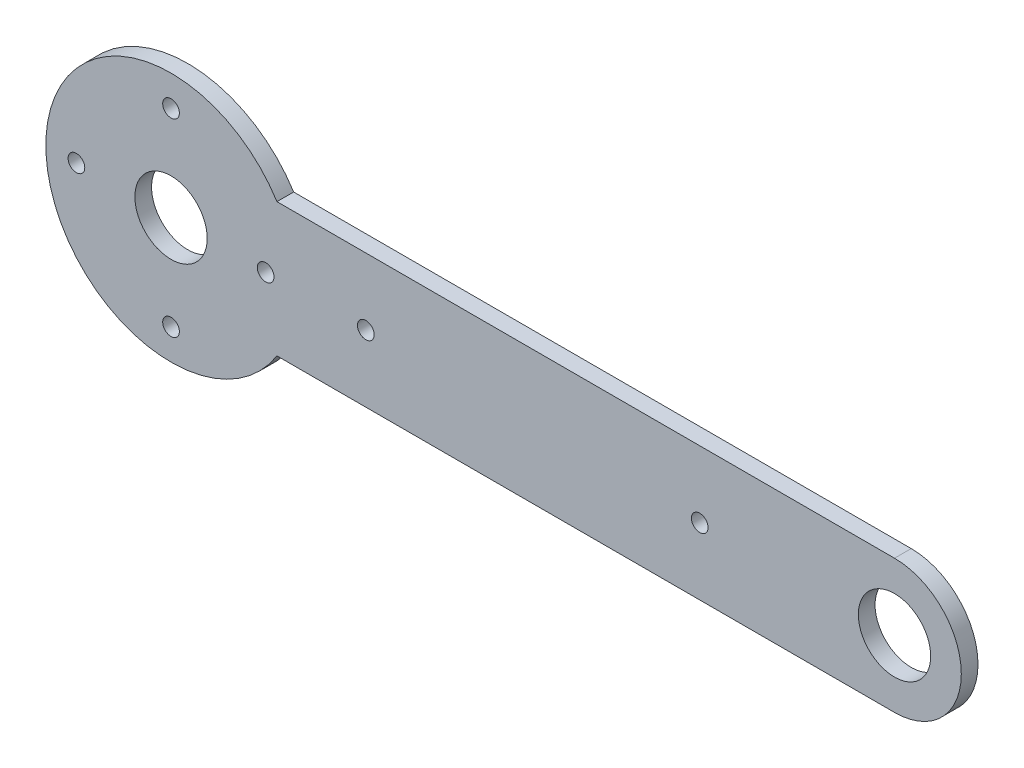
ISO-10303-21;
HEADER;
FILE_DESCRIPTION(('STEP AP214'),'2;1');
FILE_NAME('part.step','',(''),(''),'','','');
FILE_SCHEMA(('AUTOMOTIVE_DESIGN { 1 0 10303 214 1 1 1 1 }'));
ENDSEC;
DATA;
#1=APPLICATION_CONTEXT('core data for automotive mechanical design processes');
#2=APPLICATION_PROTOCOL_DEFINITION('international standard','automotive_design',2000,#1);
#3=PRODUCT_CONTEXT('',#1,'mechanical');
#4=PRODUCT('Part','Part','',(#3));
#5=PRODUCT_RELATED_PRODUCT_CATEGORY('part','',(#4));
#6=PRODUCT_DEFINITION_FORMATION('','',#4);
#7=PRODUCT_DEFINITION_CONTEXT('part definition',#1,'design');
#8=PRODUCT_DEFINITION('design','',#6,#7);
#9=PRODUCT_DEFINITION_SHAPE('','',#8);
#10=(LENGTH_UNIT() NAMED_UNIT(*) SI_UNIT(.MILLI.,.METRE.));
#11=(NAMED_UNIT(*) PLANE_ANGLE_UNIT() SI_UNIT($,.RADIAN.));
#12=(NAMED_UNIT(*) SI_UNIT($,.STERADIAN.) SOLID_ANGLE_UNIT());
#13=UNCERTAINTY_MEASURE_WITH_UNIT(LENGTH_MEASURE(1.E-05),#10,'distance_accuracy_value','');
#14=(GEOMETRIC_REPRESENTATION_CONTEXT(3) GLOBAL_UNCERTAINTY_ASSIGNED_CONTEXT((#13)) GLOBAL_UNIT_ASSIGNED_CONTEXT((#10,
#11,#12)) REPRESENTATION_CONTEXT('',''));
#15=CARTESIAN_POINT('',(0.,0.,0.));
#16=DIRECTION('',(0.,0.,1.));
#17=DIRECTION('',(1.,0.,0.));
#18=AXIS2_PLACEMENT_3D('',#15,#16,#17);
#19=CARTESIAN_POINT('',(-65.,0.,3.));
#20=DIRECTION('',(0.,0.,1.));
#21=DIRECTION('',(1.,0.,0.));
#22=AXIS2_PLACEMENT_3D('',#19,#20,#21);
#23=PLANE('',#22);
#24=CARTESIAN_POINT('',(-65.,17.,3.));
#25=DIRECTION('',(0.,0.,1.));
#26=DIRECTION('',(1.,0.,0.));
#27=AXIS2_PLACEMENT_3D('',#24,#25,#26);
#28=CIRCLE('',#27,1.5);
#29=CARTESIAN_POINT('',(-63.5,17.,3.));
#30=VERTEX_POINT('',#29);
#31=EDGE_CURVE('E240',#30,#30,#28,.T.);
#32=ORIENTED_EDGE('',*,*,#31,.F.);
#33=EDGE_LOOP('',(#32));
#34=FACE_BOUND('',#33,.T.);
#35=CARTESIAN_POINT('',(-47.9999999999998,1.80411241501588E-13,3.));
#36=DIRECTION('',(0.,0.,1.));
#37=DIRECTION('',(1.,0.,0.));
#38=AXIS2_PLACEMENT_3D('',#35,#36,#37);
#39=CIRCLE('',#38,1.5);
#40=CARTESIAN_POINT('',(-46.4999999999998,1.80411241501588E-13,3.));
#41=VERTEX_POINT('',#40);
#42=EDGE_CURVE('E248',#41,#41,#39,.T.);
#43=ORIENTED_EDGE('',*,*,#42,.F.);
#44=EDGE_LOOP('',(#43));
#45=FACE_BOUND('',#44,.T.);
#46=CARTESIAN_POINT('',(-64.9999999999996,-17.,3.));
#47=DIRECTION('',(0.,0.,1.));
#48=DIRECTION('',(1.,0.,0.));
#49=AXIS2_PLACEMENT_3D('',#46,#47,#48);
#50=CIRCLE('',#49,1.49999999999999);
#51=CARTESIAN_POINT('',(-63.4999999999996,-17.,3.));
#52=VERTEX_POINT('',#51);
#53=EDGE_CURVE('E258',#52,#52,#50,.T.);
#54=ORIENTED_EDGE('',*,*,#53,.F.);
#55=EDGE_LOOP('',(#54));
#56=FACE_BOUND('',#55,.T.);
#57=CARTESIAN_POINT('',(-81.9999999999997,0.,3.));
#58=DIRECTION('',(0.,0.,1.));
#59=DIRECTION('',(1.,0.,0.));
#60=AXIS2_PLACEMENT_3D('',#57,#58,#59);
#61=CIRCLE('',#60,1.49999999999999);
#62=CARTESIAN_POINT('',(-80.4999999999998,0.,3.));
#63=VERTEX_POINT('',#62);
#64=EDGE_CURVE('E132',#63,#63,#61,.T.);
#65=ORIENTED_EDGE('',*,*,#64,.F.);
#66=EDGE_LOOP('',(#65));
#67=FACE_BOUND('',#66,.T.);
#68=DIRECTION('',(-1.,0.,0.));
#69=VECTOR('',#68,1.);
#70=CARTESIAN_POINT('',(-65.,12.,3.));
#71=LINE('',#70,#69);
#72=CARTESIAN_POINT('',(65.,12.,3.));
#73=VERTEX_POINT('',#72);
#74=CARTESIAN_POINT('',(-45.9671336893257,12.,3.));
#75=VERTEX_POINT('',#74);
#76=EDGE_CURVE('E98',#73,#75,#71,.T.);
#77=ORIENTED_EDGE('',*,*,#76,.T.);
#78=CARTESIAN_POINT('',(-65.,0.,3.));
#79=DIRECTION('',(0.,0.,1.));
#80=DIRECTION('',(1.,0.,0.));
#81=AXIS2_PLACEMENT_3D('',#78,#79,#80);
#82=CIRCLE('',#81,22.5);
#83=CARTESIAN_POINT('',(-45.9671336893257,-12.,3.));
#84=VERTEX_POINT('',#83);
#85=EDGE_CURVE('E86',#75,#84,#82,.T.);
#86=ORIENTED_EDGE('',*,*,#85,.T.);
#87=DIRECTION('',(1.,0.,0.));
#88=VECTOR('',#87,1.);
#89=CARTESIAN_POINT('',(-65.,-12.,3.));
#90=LINE('',#89,#88);
#91=CARTESIAN_POINT('',(65.,-12.,3.));
#92=VERTEX_POINT('',#91);
#93=EDGE_CURVE('E108',#84,#92,#90,.T.);
#94=ORIENTED_EDGE('',*,*,#93,.T.);
#95=CARTESIAN_POINT('',(65.,0.,3.));
#96=DIRECTION('',(0.,0.,1.));
#97=DIRECTION('',(-1.,0.,0.));
#98=AXIS2_PLACEMENT_3D('',#95,#96,#97);
#99=CIRCLE('',#98,12.);
#100=EDGE_CURVE('E58',#92,#73,#99,.T.);
#101=ORIENTED_EDGE('',*,*,#100,.T.);
#102=EDGE_LOOP('',(#77,#86,#94,#101));
#103=FACE_BOUND('',#102,.T.);
#104=CARTESIAN_POINT('',(30.,0.,3.));
#105=DIRECTION('',(0.,0.,-1.));
#106=DIRECTION('',(-1.,0.,0.));
#107=AXIS2_PLACEMENT_3D('',#104,#105,#106);
#108=CIRCLE('',#107,1.5);
#109=CARTESIAN_POINT('',(28.5,0.,3.));
#110=VERTEX_POINT('',#109);
#111=EDGE_CURVE('E144',#110,#110,#108,.T.);
#112=ORIENTED_EDGE('',*,*,#111,.T.);
#113=EDGE_LOOP('',(#112));
#114=FACE_BOUND('',#113,.T.);
#115=CARTESIAN_POINT('',(65.,0.,3.));
#116=DIRECTION('',(0.,0.,1.));
#117=DIRECTION('',(-1.,0.,0.));
#118=AXIS2_PLACEMENT_3D('',#115,#116,#117);
#119=CIRCLE('',#118,6.49999999999999);
#120=CARTESIAN_POINT('',(58.5,0.,3.));
#121=VERTEX_POINT('',#120);
#122=EDGE_CURVE('E139',#121,#121,#119,.T.);
#123=ORIENTED_EDGE('',*,*,#122,.F.);
#124=EDGE_LOOP('',(#123));
#125=FACE_BOUND('',#124,.T.);
#126=CARTESIAN_POINT('',(-30.,0.,3.));
#127=DIRECTION('',(0.,0.,1.));
#128=DIRECTION('',(1.,0.,0.));
#129=AXIS2_PLACEMENT_3D('',#126,#127,#128);
#130=CIRCLE('',#129,1.5);
#131=CARTESIAN_POINT('',(-28.5,0.,3.));
#132=VERTEX_POINT('',#131);
#133=EDGE_CURVE('E140',#132,#132,#130,.T.);
#134=ORIENTED_EDGE('',*,*,#133,.F.);
#135=EDGE_LOOP('',(#134));
#136=FACE_BOUND('',#135,.T.);
#137=CARTESIAN_POINT('',(-65.,0.,3.));
#138=DIRECTION('',(0.,0.,1.));
#139=DIRECTION('',(1.,0.,0.));
#140=AXIS2_PLACEMENT_3D('',#137,#138,#139);
#141=CIRCLE('',#140,6.5);
#142=CARTESIAN_POINT('',(-58.5,0.,3.));
#143=VERTEX_POINT('',#142);
#144=EDGE_CURVE('E154',#143,#143,#141,.T.);
#145=ORIENTED_EDGE('',*,*,#144,.F.);
#146=EDGE_LOOP('',(#145));
#147=FACE_BOUND('',#146,.T.);
#148=ADVANCED_FACE('F40',(#34,#45,#56,#67,#103,#114,#125,#136,#147),#23,.T.);
#149=CARTESIAN_POINT('',(-65.,0.,0.));
#150=DIRECTION('',(0.,0.,1.));
#151=DIRECTION('',(1.,0.,0.));
#152=AXIS2_PLACEMENT_3D('',#149,#150,#151);
#153=PLANE('',#152);
#154=CARTESIAN_POINT('',(-65.,17.,0.));
#155=DIRECTION('',(0.,0.,1.));
#156=DIRECTION('',(1.,0.,0.));
#157=AXIS2_PLACEMENT_3D('',#154,#155,#156);
#158=CIRCLE('',#157,1.5);
#159=CARTESIAN_POINT('',(-63.5,17.,0.));
#160=VERTEX_POINT('',#159);
#161=EDGE_CURVE('E91',#160,#160,#158,.T.);
#162=ORIENTED_EDGE('',*,*,#161,.T.);
#163=EDGE_LOOP('',(#162));
#164=FACE_BOUND('',#163,.T.);
#165=CARTESIAN_POINT('',(-47.9999999999998,1.80411241501588E-13,0.));
#166=DIRECTION('',(0.,0.,1.));
#167=DIRECTION('',(1.,0.,0.));
#168=AXIS2_PLACEMENT_3D('',#165,#166,#167);
#169=CIRCLE('',#168,1.5);
#170=CARTESIAN_POINT('',(-46.4999999999998,1.80411241501588E-13,0.));
#171=VERTEX_POINT('',#170);
#172=EDGE_CURVE('E242',#171,#171,#169,.T.);
#173=ORIENTED_EDGE('',*,*,#172,.T.);
#174=EDGE_LOOP('',(#173));
#175=FACE_BOUND('',#174,.T.);
#176=CARTESIAN_POINT('',(-64.9999999999996,-17.,0.));
#177=DIRECTION('',(0.,0.,1.));
#178=DIRECTION('',(1.,0.,0.));
#179=AXIS2_PLACEMENT_3D('',#176,#177,#178);
#180=CIRCLE('',#179,1.49999999999999);
#181=CARTESIAN_POINT('',(-63.4999999999996,-17.,0.));
#182=VERTEX_POINT('',#181);
#183=EDGE_CURVE('E254',#182,#182,#180,.T.);
#184=ORIENTED_EDGE('',*,*,#183,.T.);
#185=EDGE_LOOP('',(#184));
#186=FACE_BOUND('',#185,.T.);
#187=CARTESIAN_POINT('',(-81.9999999999997,0.,0.));
#188=DIRECTION('',(0.,0.,1.));
#189=DIRECTION('',(1.,0.,0.));
#190=AXIS2_PLACEMENT_3D('',#187,#188,#189);
#191=CIRCLE('',#190,1.49999999999999);
#192=CARTESIAN_POINT('',(-80.4999999999998,0.,0.));
#193=VERTEX_POINT('',#192);
#194=EDGE_CURVE('E261',#193,#193,#191,.T.);
#195=ORIENTED_EDGE('',*,*,#194,.T.);
#196=EDGE_LOOP('',(#195));
#197=FACE_BOUND('',#196,.T.);
#198=DIRECTION('',(1.,0.,0.));
#199=VECTOR('',#198,1.);
#200=CARTESIAN_POINT('',(-65.,-12.,0.));
#201=LINE('',#200,#199);
#202=CARTESIAN_POINT('',(-45.9671336893257,-12.,0.));
#203=VERTEX_POINT('',#202);
#204=CARTESIAN_POINT('',(65.,-12.,0.));
#205=VERTEX_POINT('',#204);
#206=EDGE_CURVE('E69',#203,#205,#201,.T.);
#207=ORIENTED_EDGE('',*,*,#206,.F.);
#208=CARTESIAN_POINT('',(-65.,0.,0.));
#209=DIRECTION('',(0.,0.,1.));
#210=DIRECTION('',(1.,0.,0.));
#211=AXIS2_PLACEMENT_3D('',#208,#209,#210);
#212=CIRCLE('',#211,22.5);
#213=CARTESIAN_POINT('',(-45.9671336893257,12.,0.));
#214=VERTEX_POINT('',#213);
#215=EDGE_CURVE('E78',#214,#203,#212,.T.);
#216=ORIENTED_EDGE('',*,*,#215,.F.);
#217=DIRECTION('',(-1.,0.,0.));
#218=VECTOR('',#217,1.);
#219=CARTESIAN_POINT('',(-65.,12.,0.));
#220=LINE('',#219,#218);
#221=CARTESIAN_POINT('',(65.,12.,0.));
#222=VERTEX_POINT('',#221);
#223=EDGE_CURVE('E100',#222,#214,#220,.T.);
#224=ORIENTED_EDGE('',*,*,#223,.F.);
#225=CARTESIAN_POINT('',(65.,0.,0.));
#226=DIRECTION('',(0.,0.,1.));
#227=DIRECTION('',(-1.,0.,0.));
#228=AXIS2_PLACEMENT_3D('',#225,#226,#227);
#229=CIRCLE('',#228,12.);
#230=EDGE_CURVE('E114',#205,#222,#229,.T.);
#231=ORIENTED_EDGE('',*,*,#230,.F.);
#232=EDGE_LOOP('',(#207,#216,#224,#231));
#233=FACE_BOUND('',#232,.T.);
#234=CARTESIAN_POINT('',(65.,0.,0.));
#235=DIRECTION('',(0.,0.,1.));
#236=DIRECTION('',(-1.,0.,0.));
#237=AXIS2_PLACEMENT_3D('',#234,#235,#236);
#238=CIRCLE('',#237,6.49999999999999);
#239=CARTESIAN_POINT('',(58.5,0.,0.));
#240=VERTEX_POINT('',#239);
#241=EDGE_CURVE('E158',#240,#240,#238,.T.);
#242=ORIENTED_EDGE('',*,*,#241,.T.);
#243=EDGE_LOOP('',(#242));
#244=FACE_BOUND('',#243,.T.);
#245=CARTESIAN_POINT('',(30.,0.,0.));
#246=DIRECTION('',(0.,0.,-1.));
#247=DIRECTION('',(-1.,0.,0.));
#248=AXIS2_PLACEMENT_3D('',#245,#246,#247);
#249=CIRCLE('',#248,1.5);
#250=CARTESIAN_POINT('',(28.5,0.,0.));
#251=VERTEX_POINT('',#250);
#252=EDGE_CURVE('E129',#251,#251,#249,.T.);
#253=ORIENTED_EDGE('',*,*,#252,.F.);
#254=EDGE_LOOP('',(#253));
#255=FACE_BOUND('',#254,.T.);
#256=CARTESIAN_POINT('',(-30.,0.,0.));
#257=DIRECTION('',(0.,0.,1.));
#258=DIRECTION('',(1.,0.,0.));
#259=AXIS2_PLACEMENT_3D('',#256,#257,#258);
#260=CIRCLE('',#259,1.5);
#261=CARTESIAN_POINT('',(-28.5,0.,0.));
#262=VERTEX_POINT('',#261);
#263=EDGE_CURVE('E135',#262,#262,#260,.T.);
#264=ORIENTED_EDGE('',*,*,#263,.T.);
#265=EDGE_LOOP('',(#264));
#266=FACE_BOUND('',#265,.T.);
#267=CARTESIAN_POINT('',(-65.,0.,0.));
#268=DIRECTION('',(0.,0.,1.));
#269=DIRECTION('',(1.,0.,0.));
#270=AXIS2_PLACEMENT_3D('',#267,#268,#269);
#271=CIRCLE('',#270,6.5);
#272=CARTESIAN_POINT('',(-58.5,0.,0.));
#273=VERTEX_POINT('',#272);
#274=EDGE_CURVE('E115',#273,#273,#271,.T.);
#275=ORIENTED_EDGE('',*,*,#274,.T.);
#276=EDGE_LOOP('',(#275));
#277=FACE_BOUND('',#276,.T.);
#278=ADVANCED_FACE('F124',(#164,#175,#186,#197,#233,#244,#255,#266,#277),#153,.F.);
#279=CARTESIAN_POINT('',(-65.,-12.,3.));
#280=DIRECTION('',(0.,1.,0.));
#281=DIRECTION('',(-1.,0.,0.));
#282=AXIS2_PLACEMENT_3D('',#279,#280,#281);
#283=PLANE('',#282);
#284=ORIENTED_EDGE('',*,*,#93,.F.);
#285=DIRECTION('',(0.,0.,1.));
#286=VECTOR('',#285,1.);
#287=CARTESIAN_POINT('',(-45.9671336893257,-12.,0.));
#288=LINE('',#287,#286);
#289=EDGE_CURVE('E88',#84,#203,#288,.F.);
#290=ORIENTED_EDGE('',*,*,#289,.T.);
#291=ORIENTED_EDGE('',*,*,#206,.T.);
#292=DIRECTION('',(0.,0.,-1.));
#293=VECTOR('',#292,1.);
#294=CARTESIAN_POINT('',(65.,-12.,3.));
#295=LINE('',#294,#293);
#296=EDGE_CURVE('E50',#92,#205,#295,.T.);
#297=ORIENTED_EDGE('',*,*,#296,.F.);
#298=EDGE_LOOP('',(#284,#290,#291,#297));
#299=FACE_BOUND('',#298,.T.);
#300=ADVANCED_FACE('F42',(#299),#283,.F.);
#301=CARTESIAN_POINT('',(65.,0.,3.));
#302=DIRECTION('',(0.,0.,-1.));
#303=DIRECTION('',(-1.,0.,0.));
#304=AXIS2_PLACEMENT_3D('',#301,#302,#303);
#305=CYLINDRICAL_SURFACE('',#304,12.);
#306=ORIENTED_EDGE('',*,*,#230,.T.);
#307=DIRECTION('',(0.,0.,-1.));
#308=VECTOR('',#307,1.);
#309=CARTESIAN_POINT('',(65.,12.,3.));
#310=LINE('',#309,#308);
#311=EDGE_CURVE('E103',#73,#222,#310,.T.);
#312=ORIENTED_EDGE('',*,*,#311,.F.);
#313=ORIENTED_EDGE('',*,*,#100,.F.);
#314=ORIENTED_EDGE('',*,*,#296,.T.);
#315=EDGE_LOOP('',(#306,#312,#313,#314));
#316=FACE_BOUND('',#315,.T.);
#317=ADVANCED_FACE('F122',(#316),#305,.T.);
#318=CARTESIAN_POINT('',(-65.,12.,3.));
#319=DIRECTION('',(0.,-1.,0.));
#320=DIRECTION('',(1.,0.,0.));
#321=AXIS2_PLACEMENT_3D('',#318,#319,#320);
#322=PLANE('',#321);
#323=ORIENTED_EDGE('',*,*,#223,.T.);
#324=DIRECTION('',(0.,0.,1.));
#325=VECTOR('',#324,1.);
#326=CARTESIAN_POINT('',(-45.9671336893257,12.,0.));
#327=LINE('',#326,#325);
#328=EDGE_CURVE('E11',#214,#75,#327,.T.);
#329=ORIENTED_EDGE('',*,*,#328,.T.);
#330=ORIENTED_EDGE('',*,*,#76,.F.);
#331=ORIENTED_EDGE('',*,*,#311,.T.);
#332=EDGE_LOOP('',(#323,#329,#330,#331));
#333=FACE_BOUND('',#332,.T.);
#334=ADVANCED_FACE('F96',(#333),#322,.F.);
#335=CARTESIAN_POINT('',(65.,0.,0.));
#336=DIRECTION('',(0.,0.,1.));
#337=DIRECTION('',(1.,0.,0.));
#338=AXIS2_PLACEMENT_3D('',#335,#336,#337);
#339=CYLINDRICAL_SURFACE('',#338,6.49999999999999);
#340=ORIENTED_EDGE('',*,*,#241,.F.);
#341=EDGE_LOOP('',(#340));
#342=FACE_BOUND('',#341,.T.);
#343=ORIENTED_EDGE('',*,*,#122,.T.);
#344=EDGE_LOOP('',(#343));
#345=FACE_BOUND('',#344,.T.);
#346=ADVANCED_FACE('F182',(#342,#345),#339,.F.);
#347=CARTESIAN_POINT('',(-65.,0.,0.));
#348=DIRECTION('',(0.,0.,1.));
#349=DIRECTION('',(1.,0.,0.));
#350=AXIS2_PLACEMENT_3D('',#347,#348,#349);
#351=CYLINDRICAL_SURFACE('',#350,6.5);
#352=ORIENTED_EDGE('',*,*,#274,.F.);
#353=EDGE_LOOP('',(#352));
#354=FACE_BOUND('',#353,.T.);
#355=ORIENTED_EDGE('',*,*,#144,.T.);
#356=EDGE_LOOP('',(#355));
#357=FACE_BOUND('',#356,.T.);
#358=ADVANCED_FACE('F189',(#354,#357),#351,.F.);
#359=CARTESIAN_POINT('',(30.,0.,0.));
#360=DIRECTION('',(0.,0.,1.));
#361=DIRECTION('',(1.,0.,0.));
#362=AXIS2_PLACEMENT_3D('',#359,#360,#361);
#363=CYLINDRICAL_SURFACE('',#362,1.5);
#364=ORIENTED_EDGE('',*,*,#252,.T.);
#365=EDGE_LOOP('',(#364));
#366=FACE_BOUND('',#365,.T.);
#367=ORIENTED_EDGE('',*,*,#111,.F.);
#368=EDGE_LOOP('',(#367));
#369=FACE_BOUND('',#368,.T.);
#370=ADVANCED_FACE('F194',(#366,#369),#363,.F.);
#371=CARTESIAN_POINT('',(-30.,0.,0.));
#372=DIRECTION('',(0.,0.,1.));
#373=DIRECTION('',(1.,0.,0.));
#374=AXIS2_PLACEMENT_3D('',#371,#372,#373);
#375=CYLINDRICAL_SURFACE('',#374,1.5);
#376=ORIENTED_EDGE('',*,*,#263,.F.);
#377=EDGE_LOOP('',(#376));
#378=FACE_BOUND('',#377,.T.);
#379=ORIENTED_EDGE('',*,*,#133,.T.);
#380=EDGE_LOOP('',(#379));
#381=FACE_BOUND('',#380,.T.);
#382=ADVANCED_FACE('F206',(#378,#381),#375,.F.);
#383=CARTESIAN_POINT('',(-65.,0.,0.));
#384=DIRECTION('',(0.,0.,1.));
#385=DIRECTION('',(1.,0.,0.));
#386=AXIS2_PLACEMENT_3D('',#383,#384,#385);
#387=CYLINDRICAL_SURFACE('',#386,22.5);
#388=ORIENTED_EDGE('',*,*,#289,.F.);
#389=ORIENTED_EDGE('',*,*,#85,.F.);
#390=ORIENTED_EDGE('',*,*,#328,.F.);
#391=ORIENTED_EDGE('',*,*,#215,.T.);
#392=EDGE_LOOP('',(#388,#389,#390,#391));
#393=FACE_BOUND('',#392,.T.);
#394=ADVANCED_FACE('F87',(#393),#387,.T.);
#395=CARTESIAN_POINT('',(-81.9999999999997,0.,0.));
#396=DIRECTION('',(0.,0.,1.));
#397=DIRECTION('',(1.,0.,0.));
#398=AXIS2_PLACEMENT_3D('',#395,#396,#397);
#399=CYLINDRICAL_SURFACE('',#398,1.49999999999999);
#400=ORIENTED_EDGE('',*,*,#194,.F.);
#401=EDGE_LOOP('',(#400));
#402=FACE_BOUND('',#401,.T.);
#403=ORIENTED_EDGE('',*,*,#64,.T.);
#404=EDGE_LOOP('',(#403));
#405=FACE_BOUND('',#404,.T.);
#406=ADVANCED_FACE('F214',(#402,#405),#399,.F.);
#407=CARTESIAN_POINT('',(-64.9999999999996,-17.,0.));
#408=DIRECTION('',(0.,0.,1.));
#409=DIRECTION('',(1.,0.,0.));
#410=AXIS2_PLACEMENT_3D('',#407,#408,#409);
#411=CYLINDRICAL_SURFACE('',#410,1.49999999999999);
#412=ORIENTED_EDGE('',*,*,#183,.F.);
#413=EDGE_LOOP('',(#412));
#414=FACE_BOUND('',#413,.T.);
#415=ORIENTED_EDGE('',*,*,#53,.T.);
#416=EDGE_LOOP('',(#415));
#417=FACE_BOUND('',#416,.T.);
#418=ADVANCED_FACE('F222',(#414,#417),#411,.F.);
#419=CARTESIAN_POINT('',(-47.9999999999998,1.80411241501588E-13,0.));
#420=DIRECTION('',(0.,0.,1.));
#421=DIRECTION('',(1.,0.,0.));
#422=AXIS2_PLACEMENT_3D('',#419,#420,#421);
#423=CYLINDRICAL_SURFACE('',#422,1.5);
#424=ORIENTED_EDGE('',*,*,#172,.F.);
#425=EDGE_LOOP('',(#424));
#426=FACE_BOUND('',#425,.T.);
#427=ORIENTED_EDGE('',*,*,#42,.T.);
#428=EDGE_LOOP('',(#427));
#429=FACE_BOUND('',#428,.T.);
#430=ADVANCED_FACE('F226',(#426,#429),#423,.F.);
#431=CARTESIAN_POINT('',(-65.,17.,0.));
#432=DIRECTION('',(0.,0.,1.));
#433=DIRECTION('',(1.,0.,0.));
#434=AXIS2_PLACEMENT_3D('',#431,#432,#433);
#435=CYLINDRICAL_SURFACE('',#434,1.5);
#436=ORIENTED_EDGE('',*,*,#161,.F.);
#437=EDGE_LOOP('',(#436));
#438=FACE_BOUND('',#437,.T.);
#439=ORIENTED_EDGE('',*,*,#31,.T.);
#440=EDGE_LOOP('',(#439));
#441=FACE_BOUND('',#440,.T.);
#442=ADVANCED_FACE('F230',(#438,#441),#435,.F.);
#443=CLOSED_SHELL('',(#148,#278,#300,#317,#334,#346,#358,#370,#382,#394,#406,#418,#430,#442));
#444=MANIFOLD_SOLID_BREP('B2',#443);
#445=ADVANCED_BREP_SHAPE_REPRESENTATION('',(#18,#444),#14);
#446=SHAPE_DEFINITION_REPRESENTATION(#9,#445);
ENDSEC;
END-ISO-10303-21;
